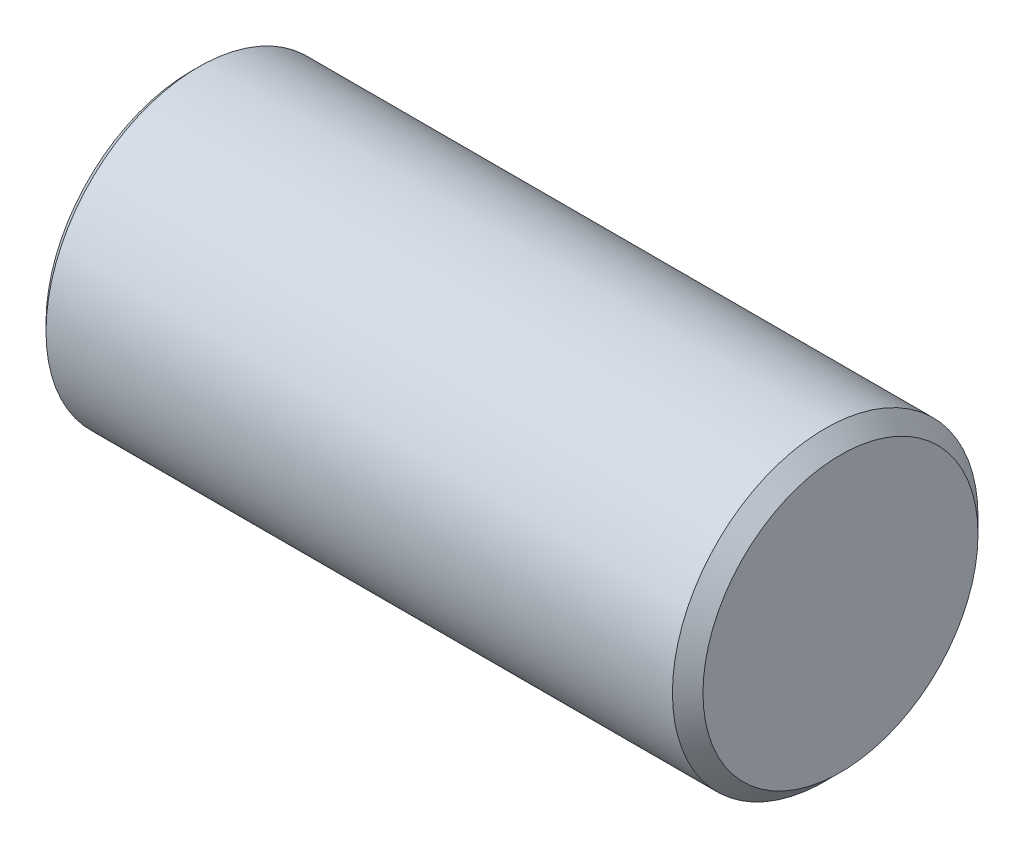
ISO-10303-21;
HEADER;
FILE_DESCRIPTION(('STEP AP214'),'2;1');
FILE_NAME('part.step','',(''),(''),'','','');
FILE_SCHEMA(('AUTOMOTIVE_DESIGN { 1 0 10303 214 1 1 1 1 }'));
ENDSEC;
DATA;
#1=APPLICATION_CONTEXT('core data for automotive mechanical design processes');
#2=APPLICATION_PROTOCOL_DEFINITION('international standard','automotive_design',2000,#1);
#3=PRODUCT_CONTEXT('',#1,'mechanical');
#4=PRODUCT('Part','Part','',(#3));
#5=PRODUCT_RELATED_PRODUCT_CATEGORY('part','',(#4));
#6=PRODUCT_DEFINITION_FORMATION('','',#4);
#7=PRODUCT_DEFINITION_CONTEXT('part definition',#1,'design');
#8=PRODUCT_DEFINITION('design','',#6,#7);
#9=PRODUCT_DEFINITION_SHAPE('','',#8);
#10=(LENGTH_UNIT() NAMED_UNIT(*) SI_UNIT(.MILLI.,.METRE.));
#11=(NAMED_UNIT(*) PLANE_ANGLE_UNIT() SI_UNIT($,.RADIAN.));
#12=(NAMED_UNIT(*) SI_UNIT($,.STERADIAN.) SOLID_ANGLE_UNIT());
#13=UNCERTAINTY_MEASURE_WITH_UNIT(LENGTH_MEASURE(1.E-05),#10,'distance_accuracy_value','');
#14=(GEOMETRIC_REPRESENTATION_CONTEXT(3) GLOBAL_UNCERTAINTY_ASSIGNED_CONTEXT((#13)) GLOBAL_UNIT_ASSIGNED_CONTEXT((#10,
#11,#12)) REPRESENTATION_CONTEXT('',''));
#15=CARTESIAN_POINT('',(0.,0.,0.));
#16=DIRECTION('',(0.,0.,1.));
#17=DIRECTION('',(1.,0.,0.));
#18=AXIS2_PLACEMENT_3D('',#15,#16,#17);
#19=CARTESIAN_POINT('',(92.6528747196546,0.,0.));
#20=DIRECTION('',(1.,0.,0.));
#21=DIRECTION('',(0.,0.,-1.));
#22=AXIS2_PLACEMENT_3D('',#19,#20,#21);
#23=PLANE('',#22);
#24=CARTESIAN_POINT('',(92.6528747196546,0.,0.));
#25=DIRECTION('',(1.,0.,0.));
#26=DIRECTION('',(0.,0.,-1.));
#27=AXIS2_PLACEMENT_3D('',#24,#25,#26);
#28=CIRCLE('',#27,18.);
#29=CARTESIAN_POINT('',(92.6528747196546,0.,-18.));
#30=VERTEX_POINT('',#29);
#31=EDGE_CURVE('E11',#30,#30,#28,.T.);
#32=ORIENTED_EDGE('',*,*,#31,.T.);
#33=EDGE_LOOP('',(#32));
#34=FACE_BOUND('',#33,.T.);
#35=ADVANCED_FACE('F35',(#34),#23,.T.);
#36=CARTESIAN_POINT('',(92.6528747196546,0.,0.));
#37=DIRECTION('',(-1.,0.,0.));
#38=DIRECTION('',(0.,0.,1.));
#39=AXIS2_PLACEMENT_3D('',#36,#37,#38);
#40=CONICAL_SURFACE('',#39,18.,0.785398163397452);
#41=CARTESIAN_POINT('',(90.6528747196546,0.,0.));
#42=DIRECTION('',(1.,0.,0.));
#43=DIRECTION('',(0.,0.,-1.));
#44=AXIS2_PLACEMENT_3D('',#41,#42,#43);
#45=CIRCLE('',#44,20.);
#46=CARTESIAN_POINT('',(90.6528747196546,0.,-20.));
#47=VERTEX_POINT('',#46);
#48=EDGE_CURVE('E41',#47,#47,#45,.T.);
#49=ORIENTED_EDGE('',*,*,#48,.T.);
#50=EDGE_LOOP('',(#49));
#51=FACE_BOUND('',#50,.T.);
#52=ORIENTED_EDGE('',*,*,#31,.F.);
#53=EDGE_LOOP('',(#52));
#54=FACE_BOUND('',#53,.T.);
#55=ADVANCED_FACE('F72',(#51,#54),#40,.T.);
#56=CARTESIAN_POINT('',(102.994030823935,0.,0.));
#57=DIRECTION('',(1.,0.,0.));
#58=DIRECTION('',(0.,0.,-1.));
#59=AXIS2_PLACEMENT_3D('',#56,#57,#58);
#60=CYLINDRICAL_SURFACE('',#59,20.);
#61=CARTESIAN_POINT('',(8.6528747196546,0.,0.));
#62=DIRECTION('',(1.,0.,0.));
#63=DIRECTION('',(0.,0.,-1.));
#64=AXIS2_PLACEMENT_3D('',#61,#62,#63);
#65=CIRCLE('',#64,20.);
#66=CARTESIAN_POINT('',(8.6528747196546,0.,-20.));
#67=VERTEX_POINT('',#66);
#68=EDGE_CURVE('E67',#67,#67,#65,.T.);
#69=ORIENTED_EDGE('',*,*,#68,.T.);
#70=EDGE_LOOP('',(#69));
#71=FACE_BOUND('',#70,.T.);
#72=ORIENTED_EDGE('',*,*,#48,.F.);
#73=EDGE_LOOP('',(#72));
#74=FACE_BOUND('',#73,.T.);
#75=ADVANCED_FACE('F75',(#71,#74),#60,.T.);
#76=CARTESIAN_POINT('',(8.6528747196546,0.,0.));
#77=DIRECTION('',(1.,0.,0.));
#78=DIRECTION('',(0.,0.,-1.));
#79=AXIS2_PLACEMENT_3D('',#76,#77,#78);
#80=CONICAL_SURFACE('',#79,20.,0.785398163397452);
#81=CARTESIAN_POINT('',(7.6528747196546,0.,0.));
#82=DIRECTION('',(1.,0.,0.));
#83=DIRECTION('',(0.,0.,-1.));
#84=AXIS2_PLACEMENT_3D('',#81,#82,#83);
#85=CIRCLE('',#84,19.);
#86=CARTESIAN_POINT('',(7.6528747196546,0.,-19.));
#87=VERTEX_POINT('',#86);
#88=EDGE_CURVE('E64',#87,#87,#85,.T.);
#89=ORIENTED_EDGE('',*,*,#88,.T.);
#90=EDGE_LOOP('',(#89));
#91=FACE_BOUND('',#90,.T.);
#92=ORIENTED_EDGE('',*,*,#68,.F.);
#93=EDGE_LOOP('',(#92));
#94=FACE_BOUND('',#93,.T.);
#95=ADVANCED_FACE('F77',(#91,#94),#80,.T.);
#96=CARTESIAN_POINT('',(7.6528747196546,0.,-19.));
#97=DIRECTION('',(-1.,0.,0.));
#98=DIRECTION('',(0.,0.,1.));
#99=AXIS2_PLACEMENT_3D('',#96,#97,#98);
#100=PLANE('',#99);
#101=CARTESIAN_POINT('',(7.6528747196546,0.,0.));
#102=DIRECTION('',(1.,0.,0.));
#103=DIRECTION('',(0.,0.,-1.));
#104=AXIS2_PLACEMENT_3D('',#101,#102,#103);
#105=CIRCLE('',#104,14.7500466259145);
#106=CARTESIAN_POINT('',(7.6528747196546,0.,-14.7500466259145));
#107=VERTEX_POINT('',#106);
#108=EDGE_CURVE('E61',#107,#107,#105,.T.);
#109=ORIENTED_EDGE('',*,*,#108,.T.);
#110=EDGE_LOOP('',(#109));
#111=FACE_BOUND('',#110,.T.);
#112=ORIENTED_EDGE('',*,*,#88,.F.);
#113=EDGE_LOOP('',(#112));
#114=FACE_BOUND('',#113,.T.);
#115=ADVANCED_FACE('F84',(#111,#114),#100,.T.);
#116=CARTESIAN_POINT('',(7.6528747196546,0.,0.));
#117=DIRECTION('',(-1.,0.,0.));
#118=DIRECTION('',(0.,0.,1.));
#119=AXIS2_PLACEMENT_3D('',#116,#117,#118);
#120=CONICAL_SURFACE('',#119,14.7500466259145,0.785398163397448);
#121=CARTESIAN_POINT('',(8.6528747196546,0.,0.));
#122=DIRECTION('',(1.,0.,0.));
#123=DIRECTION('',(0.,0.,-1.));
#124=AXIS2_PLACEMENT_3D('',#121,#122,#123);
#125=CIRCLE('',#124,13.7500466259145);
#126=CARTESIAN_POINT('',(8.6528747196546,0.,-13.7500466259145));
#127=VERTEX_POINT('',#126);
#128=EDGE_CURVE('E56',#127,#127,#125,.T.);
#129=ORIENTED_EDGE('',*,*,#128,.T.);
#130=EDGE_LOOP('',(#129));
#131=FACE_BOUND('',#130,.T.);
#132=ORIENTED_EDGE('',*,*,#108,.F.);
#133=EDGE_LOOP('',(#132));
#134=FACE_BOUND('',#133,.T.);
#135=ADVANCED_FACE('F115',(#131,#134),#120,.F.);
#136=CARTESIAN_POINT('',(102.994030823935,0.,0.));
#137=DIRECTION('',(1.,0.,0.));
#138=DIRECTION('',(0.,0.,-1.));
#139=AXIS2_PLACEMENT_3D('',#136,#137,#138);
#140=CYLINDRICAL_SURFACE('',#139,13.7500466259145);
#141=CARTESIAN_POINT('',(71.6294297140758,0.,0.));
#142=DIRECTION('',(1.,0.,0.));
#143=DIRECTION('',(0.,0.,-1.));
#144=AXIS2_PLACEMENT_3D('',#141,#142,#143);
#145=CIRCLE('',#144,13.7500466259145);
#146=CARTESIAN_POINT('',(71.6294297140758,0.,-13.7500466259145));
#147=VERTEX_POINT('',#146);
#148=EDGE_CURVE('E53',#147,#147,#145,.T.);
#149=ORIENTED_EDGE('',*,*,#148,.T.);
#150=EDGE_LOOP('',(#149));
#151=FACE_BOUND('',#150,.T.);
#152=ORIENTED_EDGE('',*,*,#128,.F.);
#153=EDGE_LOOP('',(#152));
#154=FACE_BOUND('',#153,.T.);
#155=ADVANCED_FACE('F125',(#151,#154),#140,.F.);
#156=CARTESIAN_POINT('',(71.6294297140758,0.,-3.43020549685093));
#157=DIRECTION('',(-1.,0.,0.));
#158=DIRECTION('',(0.,0.,1.));
#159=AXIS2_PLACEMENT_3D('',#156,#157,#158);
#160=PLANE('',#159);
#161=CARTESIAN_POINT('',(71.6294297140758,0.,0.));
#162=DIRECTION('',(1.,0.,0.));
#163=DIRECTION('',(0.,0.,-1.));
#164=AXIS2_PLACEMENT_3D('',#161,#162,#163);
#165=CIRCLE('',#164,3.43020549685093);
#166=CARTESIAN_POINT('',(71.6294297140758,0.,-3.43020549685093));
#167=VERTEX_POINT('',#166);
#168=EDGE_CURVE('E51',#167,#167,#165,.T.);
#169=ORIENTED_EDGE('',*,*,#168,.T.);
#170=EDGE_LOOP('',(#169));
#171=FACE_BOUND('',#170,.T.);
#172=ORIENTED_EDGE('',*,*,#148,.F.);
#173=EDGE_LOOP('',(#172));
#174=FACE_BOUND('',#173,.T.);
#175=ADVANCED_FACE('F47',(#171,#174),#160,.T.);
#176=CARTESIAN_POINT('',(71.6294297140758,0.,0.));
#177=DIRECTION('',(-1.,0.,0.));
#178=DIRECTION('',(0.,0.,1.));
#179=AXIS2_PLACEMENT_3D('',#176,#177,#178);
#180=CONICAL_SURFACE('',#179,3.43020549685093,0.585875576414255);
#181=CARTESIAN_POINT('',(76.7985263485862,0.,0.));
#182=VERTEX_POINT('',#181);
#183=VERTEX_LOOP('',#182);
#184=FACE_BOUND('',#183,.T.);
#185=ORIENTED_EDGE('',*,*,#168,.F.);
#186=EDGE_LOOP('',(#185));
#187=FACE_BOUND('',#186,.T.);
#188=ADVANCED_FACE('F44',(#184,#187),#180,.F.);
#189=CLOSED_SHELL('',(#35,#55,#75,#95,#115,#135,#155,#175,#188));
#190=MANIFOLD_SOLID_BREP('B2',#189);
#191=ADVANCED_BREP_SHAPE_REPRESENTATION('',(#18,#190),#14);
#192=SHAPE_DEFINITION_REPRESENTATION(#9,#191);
ENDSEC;
END-ISO-10303-21;
